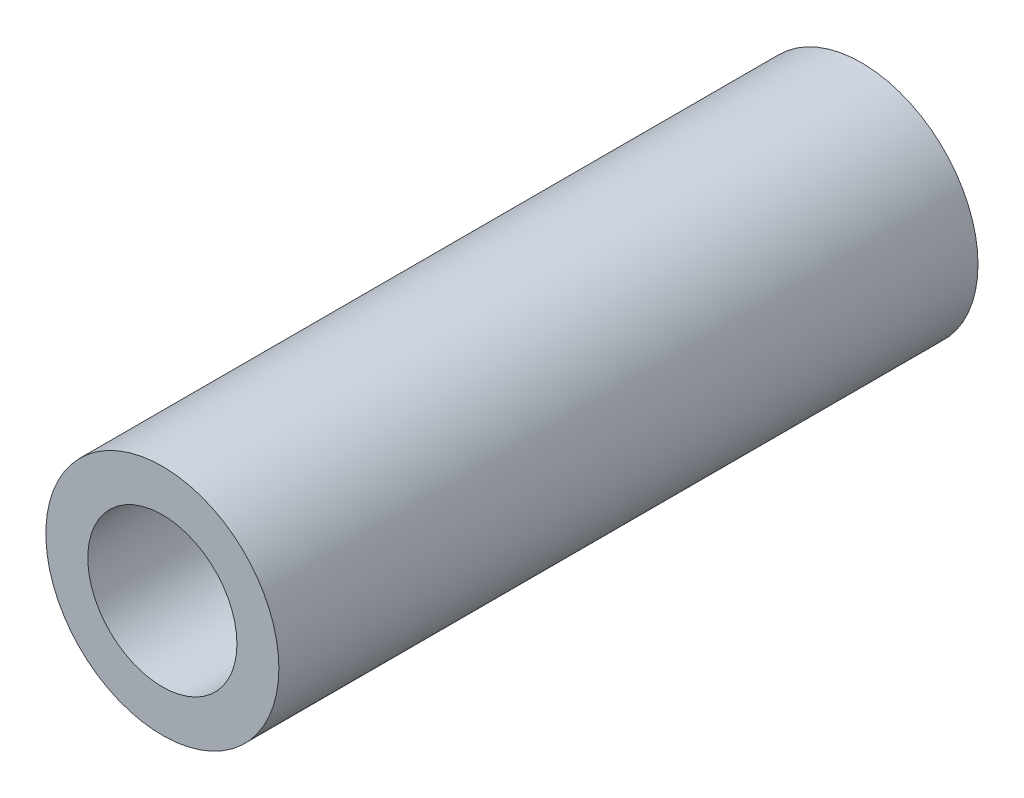
ISO-10303-21;
HEADER;
FILE_DESCRIPTION(('STEP AP214'),'2;1');
FILE_NAME('part.step','',(''),(''),'','','');
FILE_SCHEMA(('AUTOMOTIVE_DESIGN { 1 0 10303 214 1 1 1 1 }'));
ENDSEC;
DATA;
#1=APPLICATION_CONTEXT('core data for automotive mechanical design processes');
#2=APPLICATION_PROTOCOL_DEFINITION('international standard','automotive_design',2000,#1);
#3=PRODUCT_CONTEXT('',#1,'mechanical');
#4=PRODUCT('Part','Part','',(#3));
#5=PRODUCT_RELATED_PRODUCT_CATEGORY('part','',(#4));
#6=PRODUCT_DEFINITION_FORMATION('','',#4);
#7=PRODUCT_DEFINITION_CONTEXT('part definition',#1,'design');
#8=PRODUCT_DEFINITION('design','',#6,#7);
#9=PRODUCT_DEFINITION_SHAPE('','',#8);
#10=(LENGTH_UNIT() NAMED_UNIT(*) SI_UNIT(.MILLI.,.METRE.));
#11=(NAMED_UNIT(*) PLANE_ANGLE_UNIT() SI_UNIT($,.RADIAN.));
#12=(NAMED_UNIT(*) SI_UNIT($,.STERADIAN.) SOLID_ANGLE_UNIT());
#13=UNCERTAINTY_MEASURE_WITH_UNIT(LENGTH_MEASURE(1.E-05),#10,'distance_accuracy_value','');
#14=(GEOMETRIC_REPRESENTATION_CONTEXT(3) GLOBAL_UNCERTAINTY_ASSIGNED_CONTEXT((#13)) GLOBAL_UNIT_ASSIGNED_CONTEXT((#10,
#11,#12)) REPRESENTATION_CONTEXT('',''));
#15=CARTESIAN_POINT('',(0.,0.,0.));
#16=DIRECTION('',(0.,0.,1.));
#17=DIRECTION('',(1.,0.,0.));
#18=AXIS2_PLACEMENT_3D('',#15,#16,#17);
#19=CARTESIAN_POINT('',(0.,0.,15.));
#20=DIRECTION('',(0.,0.,1.));
#21=DIRECTION('',(1.,0.,0.));
#22=AXIS2_PLACEMENT_3D('',#19,#20,#21);
#23=PLANE('',#22);
#24=CARTESIAN_POINT('',(0.,0.,15.));
#25=DIRECTION('',(0.,0.,1.));
#26=DIRECTION('',(1.,0.,0.));
#27=AXIS2_PLACEMENT_3D('',#24,#25,#26);
#28=CIRCLE('',#27,2.5);
#29=CARTESIAN_POINT('',(2.5,0.,15.));
#30=VERTEX_POINT('',#29);
#31=EDGE_CURVE('E10',#30,#30,#28,.T.);
#32=ORIENTED_EDGE('',*,*,#31,.T.);
#33=EDGE_LOOP('',(#32));
#34=FACE_BOUND('',#33,.T.);
#35=CARTESIAN_POINT('',(0.,0.,15.));
#36=DIRECTION('',(0.,0.,1.));
#37=DIRECTION('',(1.,0.,0.));
#38=AXIS2_PLACEMENT_3D('',#35,#36,#37);
#39=CIRCLE('',#38,1.6);
#40=CARTESIAN_POINT('',(1.6,0.,15.));
#41=VERTEX_POINT('',#40);
#42=EDGE_CURVE('E44',#41,#41,#39,.T.);
#43=ORIENTED_EDGE('',*,*,#42,.F.);
#44=EDGE_LOOP('',(#43));
#45=FACE_BOUND('',#44,.T.);
#46=ADVANCED_FACE('F33',(#34,#45),#23,.T.);
#47=CARTESIAN_POINT('',(0.,0.,0.));
#48=DIRECTION('',(0.,0.,1.));
#49=DIRECTION('',(1.,0.,0.));
#50=AXIS2_PLACEMENT_3D('',#47,#48,#49);
#51=PLANE('',#50);
#52=CARTESIAN_POINT('',(0.,0.,0.));
#53=DIRECTION('',(0.,0.,1.));
#54=DIRECTION('',(1.,0.,0.));
#55=AXIS2_PLACEMENT_3D('',#52,#53,#54);
#56=CIRCLE('',#55,2.5);
#57=CARTESIAN_POINT('',(2.5,0.,0.));
#58=VERTEX_POINT('',#57);
#59=EDGE_CURVE('E37',#58,#58,#56,.T.);
#60=ORIENTED_EDGE('',*,*,#59,.F.);
#61=EDGE_LOOP('',(#60));
#62=FACE_BOUND('',#61,.T.);
#63=CARTESIAN_POINT('',(0.,0.,0.));
#64=DIRECTION('',(0.,0.,1.));
#65=DIRECTION('',(1.,0.,0.));
#66=AXIS2_PLACEMENT_3D('',#63,#64,#65);
#67=CIRCLE('',#66,1.6);
#68=CARTESIAN_POINT('',(1.6,0.,0.));
#69=VERTEX_POINT('',#68);
#70=EDGE_CURVE('E46',#69,#69,#67,.T.);
#71=ORIENTED_EDGE('',*,*,#70,.T.);
#72=EDGE_LOOP('',(#71));
#73=FACE_BOUND('',#72,.T.);
#74=ADVANCED_FACE('F56',(#62,#73),#51,.F.);
#75=CARTESIAN_POINT('',(0.,0.,15.));
#76=DIRECTION('',(0.,0.,-1.));
#77=DIRECTION('',(-1.,0.,0.));
#78=AXIS2_PLACEMENT_3D('',#75,#76,#77);
#79=CYLINDRICAL_SURFACE('',#78,2.5);
#80=ORIENTED_EDGE('',*,*,#31,.F.);
#81=EDGE_LOOP('',(#80));
#82=FACE_BOUND('',#81,.T.);
#83=ORIENTED_EDGE('',*,*,#59,.T.);
#84=EDGE_LOOP('',(#83));
#85=FACE_BOUND('',#84,.T.);
#86=ADVANCED_FACE('F35',(#82,#85),#79,.T.);
#87=CARTESIAN_POINT('',(0.,0.,15.));
#88=DIRECTION('',(0.,0.,-1.));
#89=DIRECTION('',(-1.,0.,0.));
#90=AXIS2_PLACEMENT_3D('',#87,#88,#89);
#91=CYLINDRICAL_SURFACE('',#90,1.6);
#92=ORIENTED_EDGE('',*,*,#42,.T.);
#93=EDGE_LOOP('',(#92));
#94=FACE_BOUND('',#93,.T.);
#95=ORIENTED_EDGE('',*,*,#70,.F.);
#96=EDGE_LOOP('',(#95));
#97=FACE_BOUND('',#96,.T.);
#98=ADVANCED_FACE('F52',(#94,#97),#91,.F.);
#99=CLOSED_SHELL('',(#46,#74,#86,#98));
#100=MANIFOLD_SOLID_BREP('B2',#99);
#101=ADVANCED_BREP_SHAPE_REPRESENTATION('',(#18,#100),#14);
#102=SHAPE_DEFINITION_REPRESENTATION(#9,#101);
ENDSEC;
END-ISO-10303-21;
